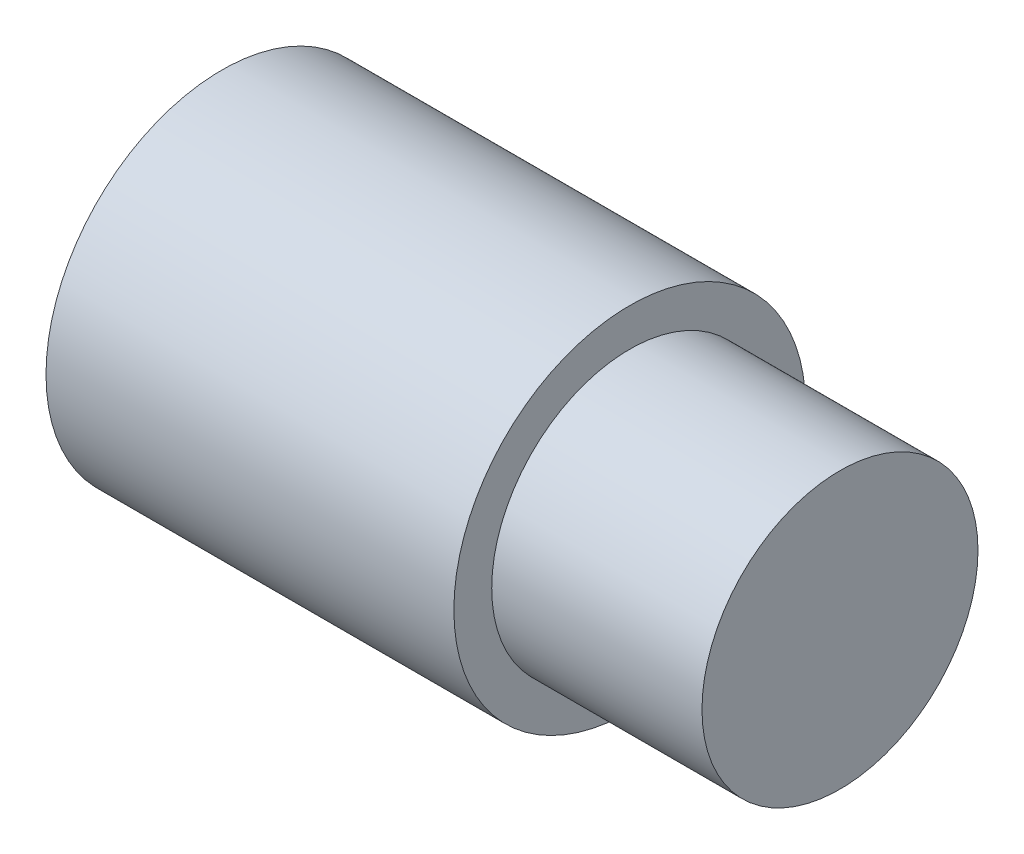
ISO-10303-21;
HEADER;
FILE_DESCRIPTION(('STEP AP214'),'2;1');
FILE_NAME('part.step','',(''),(''),'','','');
FILE_SCHEMA(('AUTOMOTIVE_DESIGN { 1 0 10303 214 1 1 1 1 }'));
ENDSEC;
DATA;
#1=APPLICATION_CONTEXT('core data for automotive mechanical design processes');
#2=APPLICATION_PROTOCOL_DEFINITION('international standard','automotive_design',2000,#1);
#3=PRODUCT_CONTEXT('',#1,'mechanical');
#4=PRODUCT('Part','Part','',(#3));
#5=PRODUCT_RELATED_PRODUCT_CATEGORY('part','',(#4));
#6=PRODUCT_DEFINITION_FORMATION('','',#4);
#7=PRODUCT_DEFINITION_CONTEXT('part definition',#1,'design');
#8=PRODUCT_DEFINITION('design','',#6,#7);
#9=PRODUCT_DEFINITION_SHAPE('','',#8);
#10=(LENGTH_UNIT() NAMED_UNIT(*) SI_UNIT(.MILLI.,.METRE.));
#11=(NAMED_UNIT(*) PLANE_ANGLE_UNIT() SI_UNIT($,.RADIAN.));
#12=(NAMED_UNIT(*) SI_UNIT($,.STERADIAN.) SOLID_ANGLE_UNIT());
#13=UNCERTAINTY_MEASURE_WITH_UNIT(LENGTH_MEASURE(1.E-05),#10,'distance_accuracy_value','');
#14=(GEOMETRIC_REPRESENTATION_CONTEXT(3) GLOBAL_UNCERTAINTY_ASSIGNED_CONTEXT((#13)) GLOBAL_UNIT_ASSIGNED_CONTEXT((#10,
#11,#12)) REPRESENTATION_CONTEXT('',''));
#15=CARTESIAN_POINT('',(0.,0.,0.));
#16=DIRECTION('',(0.,0.,1.));
#17=DIRECTION('',(1.,0.,0.));
#18=AXIS2_PLACEMENT_3D('',#15,#16,#17);
#19=CARTESIAN_POINT('',(13.3,0.,0.));
#20=DIRECTION('',(-1.,0.,0.));
#21=DIRECTION('',(0.,0.,1.));
#22=AXIS2_PLACEMENT_3D('',#19,#20,#21);
#23=PLANE('',#22);
#24=CARTESIAN_POINT('',(13.3000000000001,0.,0.));
#25=DIRECTION('',(-1.,0.,0.));
#26=DIRECTION('',(0.,0.,1.));
#27=AXIS2_PLACEMENT_3D('',#24,#25,#26);
#28=CIRCLE('',#27,8.73);
#29=CARTESIAN_POINT('',(13.3000000000001,0.,8.73));
#30=VERTEX_POINT('',#29);
#31=EDGE_CURVE('E10',#30,#30,#28,.T.);
#32=ORIENTED_EDGE('',*,*,#31,.F.);
#33=EDGE_LOOP('',(#32));
#34=FACE_BOUND('',#33,.T.);
#35=ADVANCED_FACE('F39',(#34),#23,.F.);
#36=CARTESIAN_POINT('',(-1000.,0.,0.));
#37=DIRECTION('',(-1.,0.,0.));
#38=DIRECTION('',(0.,0.,1.));
#39=AXIS2_PLACEMENT_3D('',#36,#37,#38);
#40=CYLINDRICAL_SURFACE('',#39,8.73);
#41=CARTESIAN_POINT('',(0.,0.,0.));
#42=DIRECTION('',(-1.,0.,0.));
#43=DIRECTION('',(0.,0.,1.));
#44=AXIS2_PLACEMENT_3D('',#41,#42,#43);
#45=CIRCLE('',#44,8.73);
#46=CARTESIAN_POINT('',(0.,0.,8.73));
#47=VERTEX_POINT('',#46);
#48=EDGE_CURVE('E46',#47,#47,#45,.T.);
#49=ORIENTED_EDGE('',*,*,#48,.F.);
#50=EDGE_LOOP('',(#49));
#51=FACE_BOUND('',#50,.T.);
#52=ORIENTED_EDGE('',*,*,#31,.T.);
#53=EDGE_LOOP('',(#52));
#54=FACE_BOUND('',#53,.T.);
#55=ADVANCED_FACE('F84',(#51,#54),#40,.T.);
#56=CARTESIAN_POINT('',(0.,8.73,0.));
#57=DIRECTION('',(-1.,0.,0.));
#58=DIRECTION('',(0.,0.,1.));
#59=AXIS2_PLACEMENT_3D('',#56,#57,#58);
#60=PLANE('',#59);
#61=CARTESIAN_POINT('',(0.,0.,0.));
#62=DIRECTION('',(-1.,0.,0.));
#63=DIRECTION('',(0.,0.,1.));
#64=AXIS2_PLACEMENT_3D('',#61,#62,#63);
#65=CIRCLE('',#64,11.124);
#66=CARTESIAN_POINT('',(0.,0.,11.124));
#67=VERTEX_POINT('',#66);
#68=EDGE_CURVE('E49',#67,#67,#65,.T.);
#69=ORIENTED_EDGE('',*,*,#68,.F.);
#70=EDGE_LOOP('',(#69));
#71=FACE_BOUND('',#70,.T.);
#72=ORIENTED_EDGE('',*,*,#48,.T.);
#73=EDGE_LOOP('',(#72));
#74=FACE_BOUND('',#73,.T.);
#75=ADVANCED_FACE('F79',(#71,#74),#60,.F.);
#76=CARTESIAN_POINT('',(-1000.,0.,0.));
#77=DIRECTION('',(-1.,0.,0.));
#78=DIRECTION('',(0.,0.,1.));
#79=AXIS2_PLACEMENT_3D('',#76,#77,#78);
#80=CYLINDRICAL_SURFACE('',#79,11.124);
#81=CARTESIAN_POINT('',(-25.8,0.,0.));
#82=DIRECTION('',(-1.,0.,0.));
#83=DIRECTION('',(0.,0.,1.));
#84=AXIS2_PLACEMENT_3D('',#81,#82,#83);
#85=CIRCLE('',#84,11.124);
#86=CARTESIAN_POINT('',(-25.8,0.,11.124));
#87=VERTEX_POINT('',#86);
#88=EDGE_CURVE('E54',#87,#87,#85,.T.);
#89=ORIENTED_EDGE('',*,*,#88,.F.);
#90=EDGE_LOOP('',(#89));
#91=FACE_BOUND('',#90,.T.);
#92=ORIENTED_EDGE('',*,*,#68,.T.);
#93=EDGE_LOOP('',(#92));
#94=FACE_BOUND('',#93,.T.);
#95=ADVANCED_FACE('F68',(#91,#94),#80,.T.);
#96=CARTESIAN_POINT('',(-25.8,11.124,0.));
#97=DIRECTION('',(1.,0.,0.));
#98=DIRECTION('',(0.,0.,-1.));
#99=AXIS2_PLACEMENT_3D('',#96,#97,#98);
#100=PLANE('',#99);
#101=CARTESIAN_POINT('',(-25.8,0.,0.));
#102=DIRECTION('',(1.,0.,0.));
#103=DIRECTION('',(0.,0.,-1.));
#104=AXIS2_PLACEMENT_3D('',#101,#102,#103);
#105=CIRCLE('',#104,4.7625);
#106=CARTESIAN_POINT('',(-25.8,0.,-4.7625));
#107=VERTEX_POINT('',#106);
#108=EDGE_CURVE('E45',#107,#107,#105,.F.);
#109=ORIENTED_EDGE('',*,*,#108,.F.);
#110=EDGE_LOOP('',(#109));
#111=FACE_BOUND('',#110,.T.);
#112=ORIENTED_EDGE('',*,*,#88,.T.);
#113=EDGE_LOOP('',(#112));
#114=FACE_BOUND('',#113,.T.);
#115=ADVANCED_FACE('F69',(#111,#114),#100,.F.);
#116=CARTESIAN_POINT('',(-1000.,0.,0.));
#117=DIRECTION('',(-1.,0.,0.));
#118=DIRECTION('',(0.,0.,1.));
#119=AXIS2_PLACEMENT_3D('',#116,#117,#118);
#120=CYLINDRICAL_SURFACE('',#119,4.7625);
#121=CARTESIAN_POINT('',(-9.00000000000001,0.,0.));
#122=DIRECTION('',(-1.,0.,0.));
#123=DIRECTION('',(0.,0.,1.));
#124=AXIS2_PLACEMENT_3D('',#121,#122,#123);
#125=CIRCLE('',#124,4.7625);
#126=CARTESIAN_POINT('',(-9.00000000000001,0.,4.7625));
#127=VERTEX_POINT('',#126);
#128=EDGE_CURVE('E59',#127,#127,#125,.T.);
#129=ORIENTED_EDGE('',*,*,#128,.F.);
#130=EDGE_LOOP('',(#129));
#131=FACE_BOUND('',#130,.T.);
#132=ORIENTED_EDGE('',*,*,#108,.T.);
#133=EDGE_LOOP('',(#132));
#134=FACE_BOUND('',#133,.T.);
#135=ADVANCED_FACE('F62',(#131,#134),#120,.F.);
#136=CARTESIAN_POINT('',(-9.,4.7625,0.));
#137=DIRECTION('',(-1.,0.,0.));
#138=DIRECTION('',(0.,0.,1.));
#139=AXIS2_PLACEMENT_3D('',#136,#137,#138);
#140=PLANE('',#139);
#141=ORIENTED_EDGE('',*,*,#128,.T.);
#142=EDGE_LOOP('',(#141));
#143=FACE_BOUND('',#142,.T.);
#144=ADVANCED_FACE('F94',(#143),#140,.T.);
#145=CLOSED_SHELL('',(#35,#55,#75,#95,#115,#135,#144));
#146=MANIFOLD_SOLID_BREP('B2',#145);
#147=ADVANCED_BREP_SHAPE_REPRESENTATION('',(#18,#146),#14);
#148=SHAPE_DEFINITION_REPRESENTATION(#9,#147);
ENDSEC;
END-ISO-10303-21;
